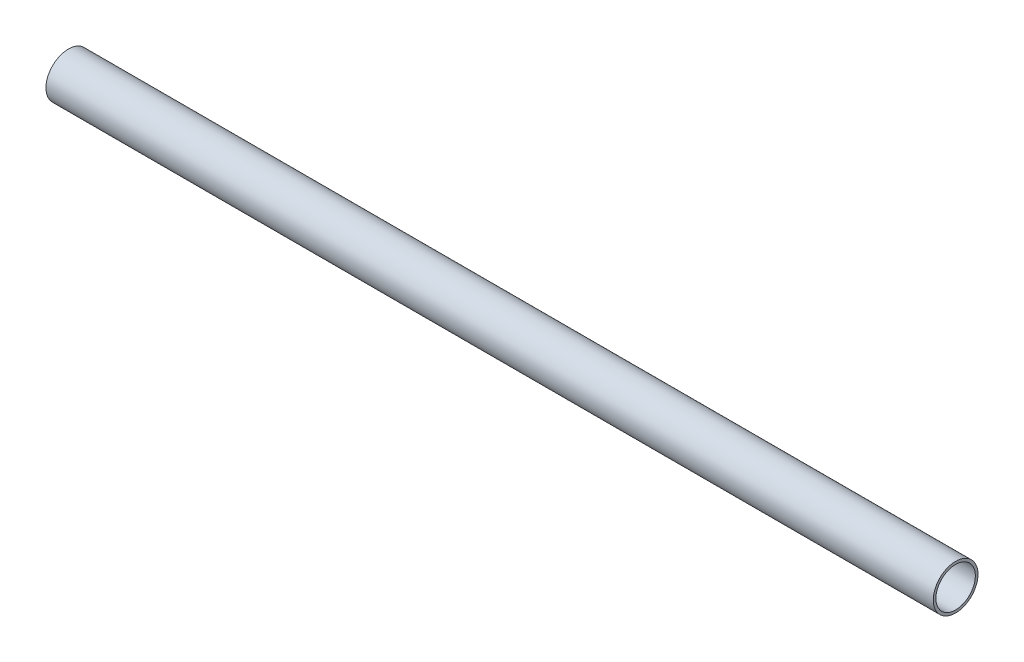
ISO-10303-21;
HEADER;
FILE_DESCRIPTION(('STEP AP214'),'2;1');
FILE_NAME('part.step','',(''),(''),'','','');
FILE_SCHEMA(('AUTOMOTIVE_DESIGN { 1 0 10303 214 1 1 1 1 }'));
ENDSEC;
DATA;
#1=APPLICATION_CONTEXT('core data for automotive mechanical design processes');
#2=APPLICATION_PROTOCOL_DEFINITION('international standard','automotive_design',2000,#1);
#3=PRODUCT_CONTEXT('',#1,'mechanical');
#4=PRODUCT('Part','Part','',(#3));
#5=PRODUCT_RELATED_PRODUCT_CATEGORY('part','',(#4));
#6=PRODUCT_DEFINITION_FORMATION('','',#4);
#7=PRODUCT_DEFINITION_CONTEXT('part definition',#1,'design');
#8=PRODUCT_DEFINITION('design','',#6,#7);
#9=PRODUCT_DEFINITION_SHAPE('','',#8);
#10=(LENGTH_UNIT() NAMED_UNIT(*) SI_UNIT(.MILLI.,.METRE.));
#11=(NAMED_UNIT(*) PLANE_ANGLE_UNIT() SI_UNIT($,.RADIAN.));
#12=(NAMED_UNIT(*) SI_UNIT($,.STERADIAN.) SOLID_ANGLE_UNIT());
#13=UNCERTAINTY_MEASURE_WITH_UNIT(LENGTH_MEASURE(1.E-05),#10,'distance_accuracy_value','');
#14=(GEOMETRIC_REPRESENTATION_CONTEXT(3) GLOBAL_UNCERTAINTY_ASSIGNED_CONTEXT((#13)) GLOBAL_UNIT_ASSIGNED_CONTEXT((#10,
#11,#12)) REPRESENTATION_CONTEXT('',''));
#15=CARTESIAN_POINT('',(0.,0.,0.));
#16=DIRECTION('',(0.,0.,1.));
#17=DIRECTION('',(1.,0.,0.));
#18=AXIS2_PLACEMENT_3D('',#15,#16,#17);
#19=CARTESIAN_POINT('',(355.6,0.,0.));
#20=DIRECTION('',(-1.,0.,0.));
#21=DIRECTION('',(0.,0.,1.));
#22=AXIS2_PLACEMENT_3D('',#19,#20,#21);
#23=CYLINDRICAL_SURFACE('',#22,7.8994);
#24=CARTESIAN_POINT('',(355.6,0.,0.));
#25=DIRECTION('',(1.,0.,0.));
#26=DIRECTION('',(0.,0.,-1.));
#27=AXIS2_PLACEMENT_3D('',#24,#25,#26);
#28=CIRCLE('',#27,7.8994);
#29=CARTESIAN_POINT('',(355.6,0.,-7.8994));
#30=VERTEX_POINT('',#29);
#31=EDGE_CURVE('E38',#30,#30,#28,.T.);
#32=ORIENTED_EDGE('',*,*,#31,.T.);
#33=EDGE_LOOP('',(#32));
#34=FACE_BOUND('',#33,.T.);
#35=CARTESIAN_POINT('',(0.,0.,0.));
#36=DIRECTION('',(1.,0.,0.));
#37=DIRECTION('',(0.,0.,-1.));
#38=AXIS2_PLACEMENT_3D('',#35,#36,#37);
#39=CIRCLE('',#38,7.8994);
#40=CARTESIAN_POINT('',(0.,0.,-7.8994));
#41=VERTEX_POINT('',#40);
#42=EDGE_CURVE('E44',#41,#41,#39,.T.);
#43=ORIENTED_EDGE('',*,*,#42,.F.);
#44=EDGE_LOOP('',(#43));
#45=FACE_BOUND('',#44,.T.);
#46=ADVANCED_FACE('F31',(#34,#45),#23,.F.);
#47=CARTESIAN_POINT('',(355.6,0.,0.));
#48=DIRECTION('',(-1.,0.,0.));
#49=DIRECTION('',(0.,0.,1.));
#50=AXIS2_PLACEMENT_3D('',#47,#48,#49);
#51=CYLINDRICAL_SURFACE('',#50,8.9662);
#52=CARTESIAN_POINT('',(355.6,0.,0.));
#53=DIRECTION('',(1.,0.,0.));
#54=DIRECTION('',(0.,0.,-1.));
#55=AXIS2_PLACEMENT_3D('',#52,#53,#54);
#56=CIRCLE('',#55,8.9662);
#57=CARTESIAN_POINT('',(355.6,0.,-8.9662));
#58=VERTEX_POINT('',#57);
#59=EDGE_CURVE('E10',#58,#58,#56,.T.);
#60=ORIENTED_EDGE('',*,*,#59,.F.);
#61=EDGE_LOOP('',(#60));
#62=FACE_BOUND('',#61,.T.);
#63=CARTESIAN_POINT('',(0.,0.,0.));
#64=DIRECTION('',(1.,0.,0.));
#65=DIRECTION('',(0.,0.,-1.));
#66=AXIS2_PLACEMENT_3D('',#63,#64,#65);
#67=CIRCLE('',#66,8.9662);
#68=CARTESIAN_POINT('',(0.,0.,-8.9662));
#69=VERTEX_POINT('',#68);
#70=EDGE_CURVE('E34',#69,#69,#67,.T.);
#71=ORIENTED_EDGE('',*,*,#70,.T.);
#72=EDGE_LOOP('',(#71));
#73=FACE_BOUND('',#72,.T.);
#74=ADVANCED_FACE('F51',(#62,#73),#51,.T.);
#75=CARTESIAN_POINT('',(355.6,0.,0.));
#76=DIRECTION('',(1.,0.,0.));
#77=DIRECTION('',(0.,0.,-1.));
#78=AXIS2_PLACEMENT_3D('',#75,#76,#77);
#79=PLANE('',#78);
#80=ORIENTED_EDGE('',*,*,#31,.F.);
#81=EDGE_LOOP('',(#80));
#82=FACE_BOUND('',#81,.T.);
#83=ORIENTED_EDGE('',*,*,#59,.T.);
#84=EDGE_LOOP('',(#83));
#85=FACE_BOUND('',#84,.T.);
#86=ADVANCED_FACE('F55',(#82,#85),#79,.T.);
#87=CARTESIAN_POINT('',(0.,0.,0.));
#88=DIRECTION('',(1.,0.,0.));
#89=DIRECTION('',(0.,0.,-1.));
#90=AXIS2_PLACEMENT_3D('',#87,#88,#89);
#91=PLANE('',#90);
#92=ORIENTED_EDGE('',*,*,#42,.T.);
#93=EDGE_LOOP('',(#92));
#94=FACE_BOUND('',#93,.T.);
#95=ORIENTED_EDGE('',*,*,#70,.F.);
#96=EDGE_LOOP('',(#95));
#97=FACE_BOUND('',#96,.T.);
#98=ADVANCED_FACE('F53',(#94,#97),#91,.F.);
#99=CLOSED_SHELL('',(#46,#74,#86,#98));
#100=MANIFOLD_SOLID_BREP('B2',#99);
#101=ADVANCED_BREP_SHAPE_REPRESENTATION('',(#18,#100),#14);
#102=SHAPE_DEFINITION_REPRESENTATION(#9,#101);
ENDSEC;
END-ISO-10303-21;
